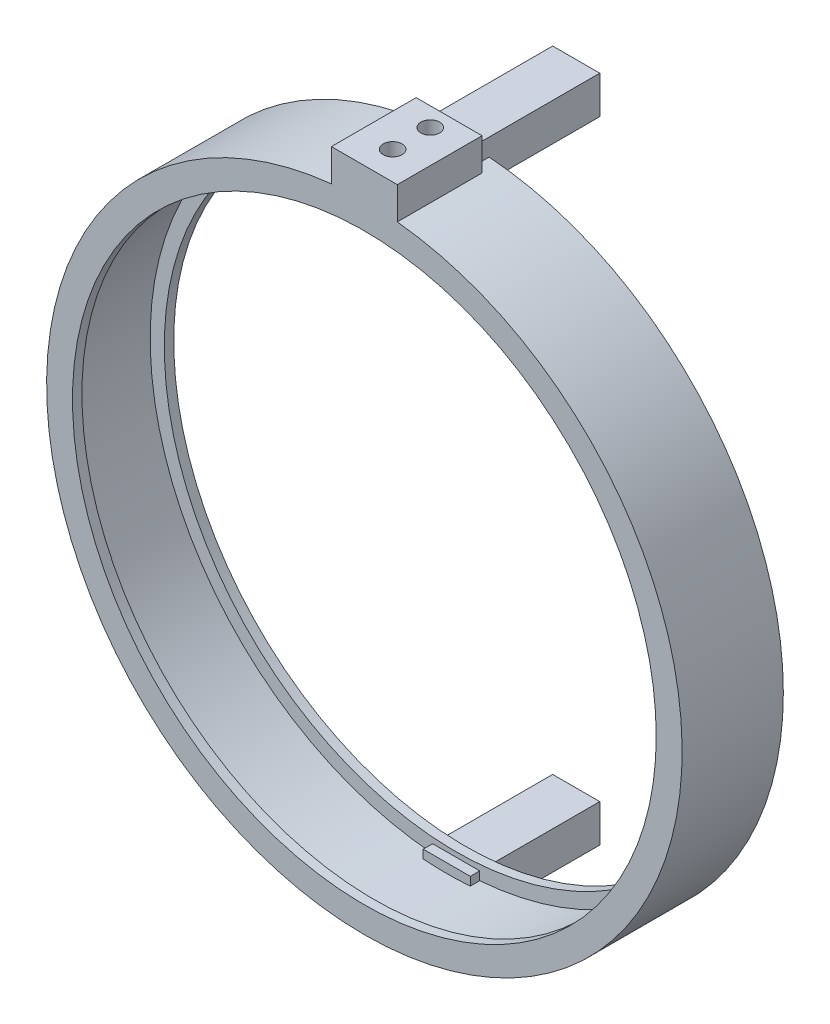
ISO-10303-21;
HEADER;
FILE_DESCRIPTION(('STEP AP214'),'2;1');
FILE_NAME('part.step','',(''),(''),'','','');
FILE_SCHEMA(('AUTOMOTIVE_DESIGN { 1 0 10303 214 1 1 1 1 }'));
ENDSEC;
DATA;
#1=APPLICATION_CONTEXT('core data for automotive mechanical design processes');
#2=APPLICATION_PROTOCOL_DEFINITION('international standard','automotive_design',2000,#1);
#3=PRODUCT_CONTEXT('',#1,'mechanical');
#4=PRODUCT('Part','Part','',(#3));
#5=PRODUCT_RELATED_PRODUCT_CATEGORY('part','',(#4));
#6=PRODUCT_DEFINITION_FORMATION('','',#4);
#7=PRODUCT_DEFINITION_CONTEXT('part definition',#1,'design');
#8=PRODUCT_DEFINITION('design','',#6,#7);
#9=PRODUCT_DEFINITION_SHAPE('','',#8);
#10=(LENGTH_UNIT() NAMED_UNIT(*) SI_UNIT(.MILLI.,.METRE.));
#11=(NAMED_UNIT(*) PLANE_ANGLE_UNIT() SI_UNIT($,.RADIAN.));
#12=(NAMED_UNIT(*) SI_UNIT($,.STERADIAN.) SOLID_ANGLE_UNIT());
#13=UNCERTAINTY_MEASURE_WITH_UNIT(LENGTH_MEASURE(1.E-05),#10,'distance_accuracy_value','');
#14=(GEOMETRIC_REPRESENTATION_CONTEXT(3) GLOBAL_UNCERTAINTY_ASSIGNED_CONTEXT((#13)) GLOBAL_UNIT_ASSIGNED_CONTEXT((#10,
#11,#12)) REPRESENTATION_CONTEXT('',''));
#15=CARTESIAN_POINT('',(0.,0.,0.));
#16=DIRECTION('',(0.,0.,1.));
#17=DIRECTION('',(1.,0.,0.));
#18=AXIS2_PLACEMENT_3D('',#15,#16,#17);
#19=CARTESIAN_POINT('',(-5.,63.,31.5));
#20=DIRECTION('',(0.,0.,1.));
#21=DIRECTION('',(1.,0.,0.));
#22=AXIS2_PLACEMENT_3D('',#19,#20,#21);
#23=PLANE('',#22);
#24=DIRECTION('',(0.,1.,0.));
#25=VECTOR('',#24,1.);
#26=CARTESIAN_POINT('',(-5.,63.,31.5));
#27=LINE('',#26,#25);
#28=CARTESIAN_POINT('',(-5.,63.,31.5));
#29=VERTEX_POINT('',#28);
#30=CARTESIAN_POINT('',(-5.,64.807406984079,31.5));
#31=VERTEX_POINT('',#30);
#32=EDGE_CURVE('E92',#29,#31,#27,.T.);
#33=ORIENTED_EDGE('',*,*,#32,.F.);
#34=DIRECTION('',(1.,0.,0.));
#35=VECTOR('',#34,1.);
#36=CARTESIAN_POINT('',(-5.,63.,31.5));
#37=LINE('',#36,#35);
#38=CARTESIAN_POINT('',(5.,63.,31.5));
#39=VERTEX_POINT('',#38);
#40=EDGE_CURVE('E49',#29,#39,#37,.T.);
#41=ORIENTED_EDGE('',*,*,#40,.T.);
#42=DIRECTION('',(0.,1.,0.));
#43=VECTOR('',#42,1.);
#44=CARTESIAN_POINT('',(5.,63.,31.5));
#45=LINE('',#44,#43);
#46=CARTESIAN_POINT('',(5.,64.807406984079,31.5));
#47=VERTEX_POINT('',#46);
#48=EDGE_CURVE('E11',#39,#47,#45,.T.);
#49=ORIENTED_EDGE('',*,*,#48,.T.);
#50=CARTESIAN_POINT('',(0.,0.,31.5));
#51=DIRECTION('',(0.,0.,1.));
#52=DIRECTION('',(1.,0.,0.));
#53=AXIS2_PLACEMENT_3D('',#50,#51,#52);
#54=CIRCLE('',#53,65.);
#55=EDGE_CURVE('E338',#47,#31,#54,.T.);
#56=ORIENTED_EDGE('',*,*,#55,.T.);
#57=EDGE_LOOP('',(#33,#41,#49,#56));
#58=FACE_BOUND('',#57,.T.);
#59=ADVANCED_FACE('F17',(#58),#23,.T.);
#60=CARTESIAN_POINT('',(-5.,-71.,31.5));
#61=DIRECTION('',(0.,0.,1.));
#62=DIRECTION('',(1.,0.,0.));
#63=AXIS2_PLACEMENT_3D('',#60,#61,#62);
#64=PLANE('',#63);
#65=DIRECTION('',(0.,1.,0.));
#66=VECTOR('',#65,1.);
#67=CARTESIAN_POINT('',(-5.,-71.,31.5));
#68=LINE('',#67,#66);
#69=CARTESIAN_POINT('',(-5.,-64.80740698407,31.5));
#70=VERTEX_POINT('',#69);
#71=CARTESIAN_POINT('',(-5.,-63.,31.5));
#72=VERTEX_POINT('',#71);
#73=EDGE_CURVE('E423',#70,#72,#68,.T.);
#74=ORIENTED_EDGE('',*,*,#73,.F.);
#75=CARTESIAN_POINT('',(0.,0.,31.5));
#76=DIRECTION('',(0.,0.,1.));
#77=DIRECTION('',(1.,0.,0.));
#78=AXIS2_PLACEMENT_3D('',#75,#76,#77);
#79=CIRCLE('',#78,65.);
#80=CARTESIAN_POINT('',(5.,-64.80740698407,31.5));
#81=VERTEX_POINT('',#80);
#82=EDGE_CURVE('E102',#70,#81,#79,.T.);
#83=ORIENTED_EDGE('',*,*,#82,.T.);
#84=DIRECTION('',(0.,1.,0.));
#85=VECTOR('',#84,1.);
#86=CARTESIAN_POINT('',(5.,-71.,31.5));
#87=LINE('',#86,#85);
#88=CARTESIAN_POINT('',(5.,-63.,31.5));
#89=VERTEX_POINT('',#88);
#90=EDGE_CURVE('E414',#81,#89,#87,.T.);
#91=ORIENTED_EDGE('',*,*,#90,.T.);
#92=DIRECTION('',(1.,0.,0.));
#93=VECTOR('',#92,1.);
#94=CARTESIAN_POINT('',(-5.,-63.,31.5));
#95=LINE('',#94,#93);
#96=EDGE_CURVE('E345',#72,#89,#95,.T.);
#97=ORIENTED_EDGE('',*,*,#96,.F.);
#98=EDGE_LOOP('',(#74,#83,#91,#97));
#99=FACE_BOUND('',#98,.T.);
#100=ADVANCED_FACE('F19',(#99),#64,.T.);
#101=CARTESIAN_POINT('',(0.,-67.,10.));
#102=DIRECTION('',(0.,0.,1.));
#103=DIRECTION('',(1.,0.,0.));
#104=AXIS2_PLACEMENT_3D('',#101,#102,#103);
#105=PLANE('',#104);
#106=CARTESIAN_POINT('',(0.,-67.,10.));
#107=DIRECTION('',(0.,0.,1.));
#108=DIRECTION('',(1.,0.,0.));
#109=AXIS2_PLACEMENT_3D('',#106,#107,#108);
#110=CIRCLE('',#109,2.);
#111=CARTESIAN_POINT('',(2.,-67.,10.));
#112=VERTEX_POINT('',#111);
#113=EDGE_CURVE('E386',#112,#112,#110,.T.);
#114=ORIENTED_EDGE('',*,*,#113,.F.);
#115=EDGE_LOOP('',(#114));
#116=FACE_BOUND('',#115,.T.);
#117=ADVANCED_FACE('F606',(#116),#105,.F.);
#118=CARTESIAN_POINT('',(0.,67.,43.));
#119=DIRECTION('',(0.,-1.,0.));
#120=DIRECTION('',(0.,0.,-1.));
#121=AXIS2_PLACEMENT_3D('',#118,#119,#120);
#122=PLANE('',#121);
#123=CARTESIAN_POINT('',(0.,67.,43.));
#124=DIRECTION('',(0.,-1.,0.));
#125=DIRECTION('',(1.,0.,0.));
#126=AXIS2_PLACEMENT_3D('',#123,#124,#125);
#127=CIRCLE('',#126,2.);
#128=CARTESIAN_POINT('',(2.,67.,43.));
#129=VERTEX_POINT('',#128);
#130=EDGE_CURVE('E349',#129,#129,#127,.T.);
#131=ORIENTED_EDGE('',*,*,#130,.F.);
#132=EDGE_LOOP('',(#131));
#133=FACE_BOUND('',#132,.T.);
#134=ADVANCED_FACE('F609',(#133),#122,.F.);
#135=CARTESIAN_POINT('',(0.,67.,35.));
#136=DIRECTION('',(0.,-1.,0.));
#137=DIRECTION('',(0.,0.,-1.));
#138=AXIS2_PLACEMENT_3D('',#135,#136,#137);
#139=PLANE('',#138);
#140=CARTESIAN_POINT('',(0.,67.,35.));
#141=DIRECTION('',(0.,-1.,0.));
#142=DIRECTION('',(1.,0.,0.));
#143=AXIS2_PLACEMENT_3D('',#140,#141,#142);
#144=CIRCLE('',#143,2.);
#145=CARTESIAN_POINT('',(2.,67.,35.));
#146=VERTEX_POINT('',#145);
#147=EDGE_CURVE('E354',#146,#146,#144,.T.);
#148=ORIENTED_EDGE('',*,*,#147,.F.);
#149=EDGE_LOOP('',(#148));
#150=FACE_BOUND('',#149,.T.);
#151=ADVANCED_FACE('F612',(#150),#139,.F.);
#152=CARTESIAN_POINT('',(0.,67.,10.));
#153=DIRECTION('',(0.,0.,1.));
#154=DIRECTION('',(1.,0.,0.));
#155=AXIS2_PLACEMENT_3D('',#152,#153,#154);
#156=PLANE('',#155);
#157=CARTESIAN_POINT('',(0.,67.,10.));
#158=DIRECTION('',(0.,0.,1.));
#159=DIRECTION('',(1.,0.,0.));
#160=AXIS2_PLACEMENT_3D('',#157,#158,#159);
#161=CIRCLE('',#160,2.);
#162=CARTESIAN_POINT('',(2.,67.,10.));
#163=VERTEX_POINT('',#162);
#164=EDGE_CURVE('E407',#163,#163,#161,.T.);
#165=ORIENTED_EDGE('',*,*,#164,.F.);
#166=EDGE_LOOP('',(#165));
#167=FACE_BOUND('',#166,.T.);
#168=ADVANCED_FACE('F614',(#167),#156,.F.);
#169=CARTESIAN_POINT('',(5.,63.,4.));
#170=DIRECTION('',(1.,0.,0.));
#171=DIRECTION('',(0.,1.,0.));
#172=AXIS2_PLACEMENT_3D('',#169,#170,#171);
#173=PLANE('',#172);
#174=DIRECTION('',(0.,0.,1.));
#175=VECTOR('',#174,1.);
#176=CARTESIAN_POINT('',(5.,63.,4.));
#177=LINE('',#176,#175);
#178=CARTESIAN_POINT('',(5.,63.,29.5));
#179=VERTEX_POINT('',#178);
#180=EDGE_CURVE('E21',#179,#39,#177,.T.);
#181=ORIENTED_EDGE('',*,*,#180,.F.);
#182=DIRECTION('',(0.,1.,0.));
#183=VECTOR('',#182,1.);
#184=CARTESIAN_POINT('',(5.,31.5,29.5));
#185=LINE('',#184,#183);
#186=CARTESIAN_POINT('',(5.,64.807406984079,29.5));
#187=VERTEX_POINT('',#186);
#188=EDGE_CURVE('E297',#179,#187,#185,.T.);
#189=ORIENTED_EDGE('',*,*,#188,.T.);
#190=DIRECTION('',(0.,0.,1.));
#191=VECTOR('',#190,1.);
#192=CARTESIAN_POINT('',(5.,64.807406984079,27.5));
#193=LINE('',#192,#191);
#194=EDGE_CURVE('E430',#187,#47,#193,.T.);
#195=ORIENTED_EDGE('',*,*,#194,.T.);
#196=ORIENTED_EDGE('',*,*,#48,.F.);
#197=EDGE_LOOP('',(#181,#189,#195,#196));
#198=FACE_BOUND('',#197,.T.);
#199=ADVANCED_FACE('F441',(#198),#173,.T.);
#200=CARTESIAN_POINT('',(-5.,63.,4.));
#201=DIRECTION('',(0.,1.,0.));
#202=DIRECTION('',(1.,0.,0.));
#203=AXIS2_PLACEMENT_3D('',#200,#201,#202);
#204=PLANE('',#203);
#205=ORIENTED_EDGE('',*,*,#40,.F.);
#206=DIRECTION('',(0.,0.,1.));
#207=VECTOR('',#206,1.);
#208=CARTESIAN_POINT('',(-5.,63.,4.));
#209=LINE('',#208,#207);
#210=CARTESIAN_POINT('',(-5.,63.,29.5));
#211=VERTEX_POINT('',#210);
#212=EDGE_CURVE('E378',#211,#29,#209,.T.);
#213=ORIENTED_EDGE('',*,*,#212,.F.);
#214=DIRECTION('',(-1.,0.,0.));
#215=VECTOR('',#214,1.);
#216=CARTESIAN_POINT('',(-2.5,63.,29.5));
#217=LINE('',#216,#215);
#218=EDGE_CURVE('E390',#179,#211,#217,.T.);
#219=ORIENTED_EDGE('',*,*,#218,.F.);
#220=ORIENTED_EDGE('',*,*,#180,.T.);
#221=EDGE_LOOP('',(#205,#213,#219,#220));
#222=FACE_BOUND('',#221,.T.);
#223=ADVANCED_FACE('F439',(#222),#204,.F.);
#224=CARTESIAN_POINT('',(-5.,63.,4.));
#225=DIRECTION('',(1.,0.,0.));
#226=DIRECTION('',(0.,1.,0.));
#227=AXIS2_PLACEMENT_3D('',#224,#225,#226);
#228=PLANE('',#227);
#229=ORIENTED_EDGE('',*,*,#32,.T.);
#230=DIRECTION('',(0.,0.,1.));
#231=VECTOR('',#230,1.);
#232=CARTESIAN_POINT('',(-5.,64.807406984079,27.5));
#233=LINE('',#232,#231);
#234=CARTESIAN_POINT('',(-5.,64.807406984079,29.5));
#235=VERTEX_POINT('',#234);
#236=EDGE_CURVE('E334',#235,#31,#233,.T.);
#237=ORIENTED_EDGE('',*,*,#236,.F.);
#238=DIRECTION('',(0.,1.,0.));
#239=VECTOR('',#238,1.);
#240=CARTESIAN_POINT('',(-5.,31.5,29.5));
#241=LINE('',#240,#239);
#242=EDGE_CURVE('E394',#211,#235,#241,.T.);
#243=ORIENTED_EDGE('',*,*,#242,.F.);
#244=ORIENTED_EDGE('',*,*,#212,.T.);
#245=EDGE_LOOP('',(#229,#237,#243,#244));
#246=FACE_BOUND('',#245,.T.);
#247=ADVANCED_FACE('F620',(#246),#228,.F.);
#248=CARTESIAN_POINT('',(0.,0.,27.5));
#249=DIRECTION('',(0.,0.,1.));
#250=DIRECTION('',(1.,0.,0.));
#251=AXIS2_PLACEMENT_3D('',#248,#249,#250);
#252=CYLINDRICAL_SURFACE('',#251,65.);
#253=CARTESIAN_POINT('',(0.,0.,47.));
#254=DIRECTION('',(0.,0.,1.));
#255=DIRECTION('',(1.,0.,0.));
#256=AXIS2_PLACEMENT_3D('',#253,#254,#255);
#257=CIRCLE('',#256,65.);
#258=CARTESIAN_POINT('',(65.,0.,47.));
#259=VERTEX_POINT('',#258);
#260=EDGE_CURVE('E353',#259,#259,#257,.T.);
#261=ORIENTED_EDGE('',*,*,#260,.T.);
#262=EDGE_LOOP('',(#261));
#263=FACE_BOUND('',#262,.T.);
#264=DIRECTION('',(0.,0.,1.));
#265=VECTOR('',#264,1.);
#266=CARTESIAN_POINT('',(5.,-64.80740698407,27.5));
#267=LINE('',#266,#265);
#268=CARTESIAN_POINT('',(5.,-64.80740698407,29.5));
#269=VERTEX_POINT('',#268);
#270=EDGE_CURVE('E153',#269,#81,#267,.T.);
#271=ORIENTED_EDGE('',*,*,#270,.T.);
#272=ORIENTED_EDGE('',*,*,#82,.F.);
#273=DIRECTION('',(0.,0.,1.));
#274=VECTOR('',#273,1.);
#275=CARTESIAN_POINT('',(-5.,-64.80740698407,27.5));
#276=LINE('',#275,#274);
#277=CARTESIAN_POINT('',(-5.,-64.80740698407,29.5));
#278=VERTEX_POINT('',#277);
#279=EDGE_CURVE('E348',#278,#70,#276,.T.);
#280=ORIENTED_EDGE('',*,*,#279,.F.);
#281=CARTESIAN_POINT('',(0.,0.,29.5));
#282=DIRECTION('',(0.,0.,1.));
#283=DIRECTION('',(1.,0.,0.));
#284=AXIS2_PLACEMENT_3D('',#281,#282,#283);
#285=CIRCLE('',#284,65.);
#286=EDGE_CURVE('E398',#235,#278,#285,.T.);
#287=ORIENTED_EDGE('',*,*,#286,.F.);
#288=ORIENTED_EDGE('',*,*,#236,.T.);
#289=ORIENTED_EDGE('',*,*,#55,.F.);
#290=ORIENTED_EDGE('',*,*,#194,.F.);
#291=CARTESIAN_POINT('',(0.,0.,29.5));
#292=DIRECTION('',(0.,0.,1.));
#293=DIRECTION('',(1.,0.,0.));
#294=AXIS2_PLACEMENT_3D('',#291,#292,#293);
#295=CIRCLE('',#294,65.);
#296=EDGE_CURVE('E294',#269,#187,#295,.T.);
#297=ORIENTED_EDGE('',*,*,#296,.F.);
#298=EDGE_LOOP('',(#271,#272,#280,#287,#288,#289,#290,#297));
#299=FACE_BOUND('',#298,.T.);
#300=ADVANCED_FACE('F448',(#263,#299),#252,.F.);
#301=CARTESIAN_POINT('',(-5.,-71.,4.));
#302=DIRECTION('',(1.,0.,0.));
#303=DIRECTION('',(0.,1.,0.));
#304=AXIS2_PLACEMENT_3D('',#301,#302,#303);
#305=PLANE('',#304);
#306=DIRECTION('',(0.,0.,1.));
#307=VECTOR('',#306,1.);
#308=CARTESIAN_POINT('',(-5.,-63.,4.));
#309=LINE('',#308,#307);
#310=CARTESIAN_POINT('',(-5.,-63.,29.5));
#311=VERTEX_POINT('',#310);
#312=EDGE_CURVE('E310',#311,#72,#309,.T.);
#313=ORIENTED_EDGE('',*,*,#312,.F.);
#314=DIRECTION('',(0.,1.,0.));
#315=VECTOR('',#314,1.);
#316=CARTESIAN_POINT('',(-5.,-35.5,29.5));
#317=LINE('',#316,#315);
#318=EDGE_CURVE('E399',#278,#311,#317,.T.);
#319=ORIENTED_EDGE('',*,*,#318,.F.);
#320=ORIENTED_EDGE('',*,*,#279,.T.);
#321=ORIENTED_EDGE('',*,*,#73,.T.);
#322=EDGE_LOOP('',(#313,#319,#320,#321));
#323=FACE_BOUND('',#322,.T.);
#324=ADVANCED_FACE('F627',(#323),#305,.F.);
#325=CARTESIAN_POINT('',(-5.,-63.,4.));
#326=DIRECTION('',(0.,1.,0.));
#327=DIRECTION('',(1.,0.,0.));
#328=AXIS2_PLACEMENT_3D('',#325,#326,#327);
#329=PLANE('',#328);
#330=DIRECTION('',(0.,0.,1.));
#331=VECTOR('',#330,1.);
#332=CARTESIAN_POINT('',(5.,-63.,4.));
#333=LINE('',#332,#331);
#334=CARTESIAN_POINT('',(5.,-63.,29.5));
#335=VERTEX_POINT('',#334);
#336=EDGE_CURVE('E306',#335,#89,#333,.T.);
#337=ORIENTED_EDGE('',*,*,#336,.F.);
#338=DIRECTION('',(-1.,0.,0.));
#339=VECTOR('',#338,1.);
#340=CARTESIAN_POINT('',(-2.5,-63.,29.5));
#341=LINE('',#340,#339);
#342=EDGE_CURVE('E402',#335,#311,#341,.T.);
#343=ORIENTED_EDGE('',*,*,#342,.T.);
#344=ORIENTED_EDGE('',*,*,#312,.T.);
#345=ORIENTED_EDGE('',*,*,#96,.T.);
#346=EDGE_LOOP('',(#337,#343,#344,#345));
#347=FACE_BOUND('',#346,.T.);
#348=ADVANCED_FACE('F633',(#347),#329,.T.);
#349=CARTESIAN_POINT('',(5.,-71.,4.));
#350=DIRECTION('',(1.,0.,0.));
#351=DIRECTION('',(0.,1.,0.));
#352=AXIS2_PLACEMENT_3D('',#349,#350,#351);
#353=PLANE('',#352);
#354=ORIENTED_EDGE('',*,*,#90,.F.);
#355=ORIENTED_EDGE('',*,*,#270,.F.);
#356=DIRECTION('',(0.,1.,0.));
#357=VECTOR('',#356,1.);
#358=CARTESIAN_POINT('',(5.,-35.5,29.5));
#359=LINE('',#358,#357);
#360=EDGE_CURVE('E298',#269,#335,#359,.T.);
#361=ORIENTED_EDGE('',*,*,#360,.T.);
#362=ORIENTED_EDGE('',*,*,#336,.T.);
#363=EDGE_LOOP('',(#354,#355,#361,#362));
#364=FACE_BOUND('',#363,.T.);
#365=ADVANCED_FACE('F629',(#364),#353,.T.);
#366=CARTESIAN_POINT('',(0.,-67.,-2.));
#367=DIRECTION('',(0.,0.,1.));
#368=DIRECTION('',(1.,0.,0.));
#369=AXIS2_PLACEMENT_3D('',#366,#367,#368);
#370=CYLINDRICAL_SURFACE('',#369,2.);
#371=ORIENTED_EDGE('',*,*,#113,.T.);
#372=EDGE_LOOP('',(#371));
#373=FACE_BOUND('',#372,.T.);
#374=CARTESIAN_POINT('',(0.,-67.,4.));
#375=DIRECTION('',(0.,0.,1.));
#376=DIRECTION('',(1.,0.,0.));
#377=AXIS2_PLACEMENT_3D('',#374,#375,#376);
#378=CIRCLE('',#377,2.);
#379=CARTESIAN_POINT('',(2.,-67.,4.));
#380=VERTEX_POINT('',#379);
#381=EDGE_CURVE('E374',#380,#380,#378,.T.);
#382=ORIENTED_EDGE('',*,*,#381,.F.);
#383=EDGE_LOOP('',(#382));
#384=FACE_BOUND('',#383,.T.);
#385=ADVANCED_FACE('F632',(#373,#384),#370,.F.);
#386=CARTESIAN_POINT('',(0.,0.,47.));
#387=DIRECTION('',(0.,0.,1.));
#388=DIRECTION('',(1.,0.,0.));
#389=AXIS2_PLACEMENT_3D('',#386,#387,#388);
#390=PLANE('',#389);
#391=CARTESIAN_POINT('',(0.,0.,47.));
#392=DIRECTION('',(0.,0.,1.));
#393=DIRECTION('',(1.,0.,0.));
#394=AXIS2_PLACEMENT_3D('',#391,#392,#393);
#395=CIRCLE('',#394,62.);
#396=CARTESIAN_POINT('',(62.,0.,47.));
#397=VERTEX_POINT('',#396);
#398=EDGE_CURVE('E285',#397,#397,#395,.T.);
#399=ORIENTED_EDGE('',*,*,#398,.T.);
#400=EDGE_LOOP('',(#399));
#401=FACE_BOUND('',#400,.T.);
#402=ORIENTED_EDGE('',*,*,#260,.F.);
#403=EDGE_LOOP('',(#402));
#404=FACE_BOUND('',#403,.T.);
#405=ADVANCED_FACE('F636',(#401,#404),#390,.F.);
#406=CARTESIAN_POINT('',(0.,81.,43.));
#407=DIRECTION('',(0.,-1.,0.));
#408=DIRECTION('',(1.,0.,0.));
#409=AXIS2_PLACEMENT_3D('',#406,#407,#408);
#410=CYLINDRICAL_SURFACE('',#409,2.);
#411=ORIENTED_EDGE('',*,*,#130,.T.);
#412=EDGE_LOOP('',(#411));
#413=FACE_BOUND('',#412,.T.);
#414=CARTESIAN_POINT('',(0.,74.,43.));
#415=DIRECTION('',(0.,-1.,0.));
#416=DIRECTION('',(1.,0.,0.));
#417=AXIS2_PLACEMENT_3D('',#414,#415,#416);
#418=CIRCLE('',#417,2.);
#419=CARTESIAN_POINT('',(2.,74.,43.));
#420=VERTEX_POINT('',#419);
#421=EDGE_CURVE('E281',#420,#420,#418,.T.);
#422=ORIENTED_EDGE('',*,*,#421,.F.);
#423=EDGE_LOOP('',(#422));
#424=FACE_BOUND('',#423,.T.);
#425=ADVANCED_FACE('F640',(#413,#424),#410,.F.);
#426=CARTESIAN_POINT('',(0.,81.,35.));
#427=DIRECTION('',(0.,-1.,0.));
#428=DIRECTION('',(1.,0.,0.));
#429=AXIS2_PLACEMENT_3D('',#426,#427,#428);
#430=CYLINDRICAL_SURFACE('',#429,2.);
#431=ORIENTED_EDGE('',*,*,#147,.T.);
#432=EDGE_LOOP('',(#431));
#433=FACE_BOUND('',#432,.T.);
#434=CARTESIAN_POINT('',(0.,74.,35.));
#435=DIRECTION('',(0.,-1.,0.));
#436=DIRECTION('',(1.,0.,0.));
#437=AXIS2_PLACEMENT_3D('',#434,#435,#436);
#438=CIRCLE('',#437,2.);
#439=CARTESIAN_POINT('',(2.,74.,35.));
#440=VERTEX_POINT('',#439);
#441=EDGE_CURVE('E286',#440,#440,#438,.T.);
#442=ORIENTED_EDGE('',*,*,#441,.F.);
#443=EDGE_LOOP('',(#442));
#444=FACE_BOUND('',#443,.T.);
#445=ADVANCED_FACE('F599',(#433,#444),#430,.F.);
#446=CARTESIAN_POINT('',(0.,67.,-2.));
#447=DIRECTION('',(0.,0.,1.));
#448=DIRECTION('',(1.,0.,0.));
#449=AXIS2_PLACEMENT_3D('',#446,#447,#448);
#450=CYLINDRICAL_SURFACE('',#449,2.);
#451=ORIENTED_EDGE('',*,*,#164,.T.);
#452=EDGE_LOOP('',(#451));
#453=FACE_BOUND('',#452,.T.);
#454=CARTESIAN_POINT('',(0.,67.,4.));
#455=DIRECTION('',(0.,0.,1.));
#456=DIRECTION('',(1.,0.,0.));
#457=AXIS2_PLACEMENT_3D('',#454,#455,#456);
#458=CIRCLE('',#457,2.);
#459=CARTESIAN_POINT('',(2.,67.,4.));
#460=VERTEX_POINT('',#459);
#461=EDGE_CURVE('E367',#460,#460,#458,.T.);
#462=ORIENTED_EDGE('',*,*,#461,.F.);
#463=EDGE_LOOP('',(#462));
#464=FACE_BOUND('',#463,.T.);
#465=ADVANCED_FACE('F589',(#453,#464),#450,.F.);
#466=CARTESIAN_POINT('',(0.,0.,29.5));
#467=DIRECTION('',(0.,0.,1.));
#468=DIRECTION('',(1.,0.,0.));
#469=AXIS2_PLACEMENT_3D('',#466,#467,#468);
#470=PLANE('',#469);
#471=CARTESIAN_POINT('',(0.,0.,29.5));
#472=DIRECTION('',(0.,0.,1.));
#473=DIRECTION('',(1.,0.,0.));
#474=AXIS2_PLACEMENT_3D('',#471,#472,#473);
#475=CIRCLE('',#474,62.);
#476=CARTESIAN_POINT('',(62.,0.,29.5));
#477=VERTEX_POINT('',#476);
#478=EDGE_CURVE('E368',#477,#477,#475,.T.);
#479=ORIENTED_EDGE('',*,*,#478,.F.);
#480=EDGE_LOOP('',(#479));
#481=FACE_BOUND('',#480,.T.);
#482=ORIENTED_EDGE('',*,*,#360,.F.);
#483=ORIENTED_EDGE('',*,*,#296,.T.);
#484=ORIENTED_EDGE('',*,*,#188,.F.);
#485=ORIENTED_EDGE('',*,*,#218,.T.);
#486=ORIENTED_EDGE('',*,*,#242,.T.);
#487=ORIENTED_EDGE('',*,*,#286,.T.);
#488=ORIENTED_EDGE('',*,*,#318,.T.);
#489=ORIENTED_EDGE('',*,*,#342,.F.);
#490=EDGE_LOOP('',(#482,#483,#484,#485,#486,#487,#488,#489));
#491=FACE_BOUND('',#490,.T.);
#492=ADVANCED_FACE('F446',(#481,#491),#470,.T.);
#493=CARTESIAN_POINT('',(-5.,-71.,4.));
#494=DIRECTION('',(0.,1.,0.));
#495=DIRECTION('',(1.,0.,0.));
#496=AXIS2_PLACEMENT_3D('',#493,#494,#495);
#497=PLANE('',#496);
#498=DIRECTION('',(0.,0.,1.));
#499=VECTOR('',#498,1.);
#500=CARTESIAN_POINT('',(5.,-71.,4.));
#501=LINE('',#500,#499);
#502=CARTESIAN_POINT('',(5.,-71.,4.));
#503=VERTEX_POINT('',#502);
#504=CARTESIAN_POINT('',(5.,-71.,31.5));
#505=VERTEX_POINT('',#504);
#506=EDGE_CURVE('E339',#503,#505,#501,.T.);
#507=ORIENTED_EDGE('',*,*,#506,.T.);
#508=DIRECTION('',(1.,0.,0.));
#509=VECTOR('',#508,1.);
#510=CARTESIAN_POINT('',(-5.,-71.,31.5));
#511=LINE('',#510,#509);
#512=CARTESIAN_POINT('',(-5.,-71.,31.5));
#513=VERTEX_POINT('',#512);
#514=EDGE_CURVE('E329',#513,#505,#511,.T.);
#515=ORIENTED_EDGE('',*,*,#514,.F.);
#516=DIRECTION('',(0.,0.,1.));
#517=VECTOR('',#516,1.);
#518=CARTESIAN_POINT('',(-5.,-71.,4.));
#519=LINE('',#518,#517);
#520=CARTESIAN_POINT('',(-5.,-71.,4.));
#521=VERTEX_POINT('',#520);
#522=EDGE_CURVE('E322',#521,#513,#519,.T.);
#523=ORIENTED_EDGE('',*,*,#522,.F.);
#524=DIRECTION('',(1.,0.,0.));
#525=VECTOR('',#524,1.);
#526=CARTESIAN_POINT('',(-5.,-71.,4.));
#527=LINE('',#526,#525);
#528=EDGE_CURVE('E302',#521,#503,#527,.T.);
#529=ORIENTED_EDGE('',*,*,#528,.T.);
#530=EDGE_LOOP('',(#507,#515,#523,#529));
#531=FACE_BOUND('',#530,.T.);
#532=ADVANCED_FACE('F588',(#531),#497,.F.);
#533=CARTESIAN_POINT('',(-5.,-71.,4.));
#534=DIRECTION('',(0.,0.,1.));
#535=DIRECTION('',(1.,0.,0.));
#536=AXIS2_PLACEMENT_3D('',#533,#534,#535);
#537=PLANE('',#536);
#538=ORIENTED_EDGE('',*,*,#381,.T.);
#539=EDGE_LOOP('',(#538));
#540=FACE_BOUND('',#539,.T.);
#541=DIRECTION('',(1.,0.,0.));
#542=VECTOR('',#541,1.);
#543=CARTESIAN_POINT('',(-5.,-63.,4.));
#544=LINE('',#543,#542);
#545=CARTESIAN_POINT('',(-5.,-63.,4.));
#546=VERTEX_POINT('',#545);
#547=CARTESIAN_POINT('',(5.,-63.,4.));
#548=VERTEX_POINT('',#547);
#549=EDGE_CURVE('E142',#546,#548,#544,.T.);
#550=ORIENTED_EDGE('',*,*,#549,.T.);
#551=DIRECTION('',(0.,1.,0.));
#552=VECTOR('',#551,1.);
#553=CARTESIAN_POINT('',(5.,-71.,4.));
#554=LINE('',#553,#552);
#555=EDGE_CURVE('E342',#503,#548,#554,.T.);
#556=ORIENTED_EDGE('',*,*,#555,.F.);
#557=ORIENTED_EDGE('',*,*,#528,.F.);
#558=DIRECTION('',(0.,1.,0.));
#559=VECTOR('',#558,1.);
#560=CARTESIAN_POINT('',(-5.,-71.,4.));
#561=LINE('',#560,#559);
#562=EDGE_CURVE('E321',#521,#546,#561,.T.);
#563=ORIENTED_EDGE('',*,*,#562,.T.);
#564=EDGE_LOOP('',(#550,#556,#557,#563));
#565=FACE_BOUND('',#564,.T.);
#566=ADVANCED_FACE('F596',(#540,#565),#537,.F.);
#567=CARTESIAN_POINT('',(0.,0.,47.));
#568=DIRECTION('',(0.,0.,1.));
#569=DIRECTION('',(1.,0.,0.));
#570=AXIS2_PLACEMENT_3D('',#567,#568,#569);
#571=CYLINDRICAL_SURFACE('',#570,62.);
#572=CARTESIAN_POINT('',(0.,0.,49.));
#573=DIRECTION('',(0.,0.,1.));
#574=DIRECTION('',(1.,0.,0.));
#575=AXIS2_PLACEMENT_3D('',#572,#573,#574);
#576=CIRCLE('',#575,62.);
#577=CARTESIAN_POINT('',(62.,0.,49.));
#578=VERTEX_POINT('',#577);
#579=EDGE_CURVE('E246',#578,#578,#576,.T.);
#580=ORIENTED_EDGE('',*,*,#579,.T.);
#581=EDGE_LOOP('',(#580));
#582=FACE_BOUND('',#581,.T.);
#583=ORIENTED_EDGE('',*,*,#398,.F.);
#584=EDGE_LOOP('',(#583));
#585=FACE_BOUND('',#584,.T.);
#586=ADVANCED_FACE('F654',(#582,#585),#571,.F.);
#587=CARTESIAN_POINT('',(-7.,74.,31.));
#588=DIRECTION('',(0.,1.,0.));
#589=DIRECTION('',(1.,0.,0.));
#590=AXIS2_PLACEMENT_3D('',#587,#588,#589);
#591=PLANE('',#590);
#592=ORIENTED_EDGE('',*,*,#421,.T.);
#593=EDGE_LOOP('',(#592));
#594=FACE_BOUND('',#593,.T.);
#595=ORIENTED_EDGE('',*,*,#441,.T.);
#596=EDGE_LOOP('',(#595));
#597=FACE_BOUND('',#596,.T.);
#598=DIRECTION('',(1.,0.,0.));
#599=VECTOR('',#598,1.);
#600=CARTESIAN_POINT('',(-7.,74.,31.));
#601=LINE('',#600,#599);
#602=CARTESIAN_POINT('',(-7.,74.,31.));
#603=VERTEX_POINT('',#602);
#604=CARTESIAN_POINT('',(7.,74.,31.));
#605=VERTEX_POINT('',#604);
#606=EDGE_CURVE('E252',#603,#605,#601,.T.);
#607=ORIENTED_EDGE('',*,*,#606,.F.);
#608=DIRECTION('',(0.,0.,1.));
#609=VECTOR('',#608,1.);
#610=CARTESIAN_POINT('',(-7.,74.,31.));
#611=LINE('',#610,#609);
#612=CARTESIAN_POINT('',(-7.,74.,49.));
#613=VERTEX_POINT('',#612);
#614=EDGE_CURVE('E236',#603,#613,#611,.T.);
#615=ORIENTED_EDGE('',*,*,#614,.T.);
#616=DIRECTION('',(1.,0.,0.));
#617=VECTOR('',#616,1.);
#618=CARTESIAN_POINT('',(-7.,74.,49.));
#619=LINE('',#618,#617);
#620=CARTESIAN_POINT('',(7.,74.,49.));
#621=VERTEX_POINT('',#620);
#622=EDGE_CURVE('E167',#613,#621,#619,.T.);
#623=ORIENTED_EDGE('',*,*,#622,.T.);
#624=DIRECTION('',(0.,0.,1.));
#625=VECTOR('',#624,1.);
#626=CARTESIAN_POINT('',(7.,74.,31.));
#627=LINE('',#626,#625);
#628=EDGE_CURVE('E261',#605,#621,#627,.T.);
#629=ORIENTED_EDGE('',*,*,#628,.F.);
#630=EDGE_LOOP('',(#607,#615,#623,#629));
#631=FACE_BOUND('',#630,.T.);
#632=ADVANCED_FACE('F260',(#594,#597,#631),#591,.T.);
#633=CARTESIAN_POINT('',(-5.,63.,4.));
#634=DIRECTION('',(0.,0.,1.));
#635=DIRECTION('',(1.,0.,0.));
#636=AXIS2_PLACEMENT_3D('',#633,#634,#635);
#637=PLANE('',#636);
#638=ORIENTED_EDGE('',*,*,#461,.T.);
#639=EDGE_LOOP('',(#638));
#640=FACE_BOUND('',#639,.T.);
#641=DIRECTION('',(1.,0.,0.));
#642=VECTOR('',#641,1.);
#643=CARTESIAN_POINT('',(-5.,71.,4.));
#644=LINE('',#643,#642);
#645=CARTESIAN_POINT('',(-5.,71.,4.));
#646=VERTEX_POINT('',#645);
#647=CARTESIAN_POINT('',(5.,71.,4.));
#648=VERTEX_POINT('',#647);
#649=EDGE_CURVE('E364',#646,#648,#644,.T.);
#650=ORIENTED_EDGE('',*,*,#649,.T.);
#651=DIRECTION('',(0.,1.,0.));
#652=VECTOR('',#651,1.);
#653=CARTESIAN_POINT('',(5.,63.,4.));
#654=LINE('',#653,#652);
#655=CARTESIAN_POINT('',(5.,63.,4.));
#656=VERTEX_POINT('',#655);
#657=EDGE_CURVE('E496',#656,#648,#654,.T.);
#658=ORIENTED_EDGE('',*,*,#657,.F.);
#659=DIRECTION('',(1.,0.,0.));
#660=VECTOR('',#659,1.);
#661=CARTESIAN_POINT('',(-5.,63.,4.));
#662=LINE('',#661,#660);
#663=CARTESIAN_POINT('',(-5.,63.,4.));
#664=VERTEX_POINT('',#663);
#665=EDGE_CURVE('E361',#664,#656,#662,.T.);
#666=ORIENTED_EDGE('',*,*,#665,.F.);
#667=DIRECTION('',(0.,1.,0.));
#668=VECTOR('',#667,1.);
#669=CARTESIAN_POINT('',(-5.,63.,4.));
#670=LINE('',#669,#668);
#671=EDGE_CURVE('E313',#664,#646,#670,.T.);
#672=ORIENTED_EDGE('',*,*,#671,.T.);
#673=EDGE_LOOP('',(#650,#658,#666,#672));
#674=FACE_BOUND('',#673,.T.);
#675=ADVANCED_FACE('F509',(#640,#674),#637,.F.);
#676=CARTESIAN_POINT('',(-5.,71.,4.));
#677=DIRECTION('',(0.,1.,0.));
#678=DIRECTION('',(1.,0.,0.));
#679=AXIS2_PLACEMENT_3D('',#676,#677,#678);
#680=PLANE('',#679);
#681=DIRECTION('',(0.,0.,1.));
#682=VECTOR('',#681,1.);
#683=CARTESIAN_POINT('',(5.,71.,4.));
#684=LINE('',#683,#682);
#685=CARTESIAN_POINT('',(5.,71.,31.));
#686=VERTEX_POINT('',#685);
#687=EDGE_CURVE('E274',#648,#686,#684,.T.);
#688=ORIENTED_EDGE('',*,*,#687,.F.);
#689=ORIENTED_EDGE('',*,*,#649,.F.);
#690=DIRECTION('',(0.,0.,1.));
#691=VECTOR('',#690,1.);
#692=CARTESIAN_POINT('',(-5.,71.,4.));
#693=LINE('',#692,#691);
#694=CARTESIAN_POINT('',(-5.,71.,31.));
#695=VERTEX_POINT('',#694);
#696=EDGE_CURVE('E178',#646,#695,#693,.T.);
#697=ORIENTED_EDGE('',*,*,#696,.T.);
#698=DIRECTION('',(1.,0.,0.));
#699=VECTOR('',#698,1.);
#700=CARTESIAN_POINT('',(-6.,71.,31.));
#701=LINE('',#700,#699);
#702=EDGE_CURVE('E271',#695,#686,#701,.T.);
#703=ORIENTED_EDGE('',*,*,#702,.T.);
#704=EDGE_LOOP('',(#688,#689,#697,#703));
#705=FACE_BOUND('',#704,.T.);
#706=ADVANCED_FACE('F513',(#705),#680,.T.);
#707=CARTESIAN_POINT('',(0.,0.,27.5));
#708=DIRECTION('',(0.,0.,1.));
#709=DIRECTION('',(1.,0.,0.));
#710=AXIS2_PLACEMENT_3D('',#707,#708,#709);
#711=CYLINDRICAL_SURFACE('',#710,62.);
#712=ORIENTED_EDGE('',*,*,#478,.T.);
#713=EDGE_LOOP('',(#712));
#714=FACE_BOUND('',#713,.T.);
#715=CARTESIAN_POINT('',(0.,0.,27.5));
#716=DIRECTION('',(0.,0.,1.));
#717=DIRECTION('',(1.,0.,0.));
#718=AXIS2_PLACEMENT_3D('',#715,#716,#717);
#719=CIRCLE('',#718,62.);
#720=CARTESIAN_POINT('',(62.,0.,27.5));
#721=VERTEX_POINT('',#720);
#722=EDGE_CURVE('E487',#721,#721,#719,.T.);
#723=ORIENTED_EDGE('',*,*,#722,.F.);
#724=EDGE_LOOP('',(#723));
#725=FACE_BOUND('',#724,.T.);
#726=ADVANCED_FACE('F584',(#714,#725),#711,.F.);
#727=CARTESIAN_POINT('',(-5.,-63.,4.));
#728=DIRECTION('',(0.,1.,0.));
#729=DIRECTION('',(1.,0.,0.));
#730=AXIS2_PLACEMENT_3D('',#727,#728,#729);
#731=PLANE('',#730);
#732=DIRECTION('',(0.,0.,1.));
#733=VECTOR('',#732,1.);
#734=CARTESIAN_POINT('',(5.,-63.,4.));
#735=LINE('',#734,#733);
#736=CARTESIAN_POINT('',(5.,-63.,27.5));
#737=VERTEX_POINT('',#736);
#738=EDGE_CURVE('E358',#548,#737,#735,.T.);
#739=ORIENTED_EDGE('',*,*,#738,.F.);
#740=ORIENTED_EDGE('',*,*,#549,.F.);
#741=DIRECTION('',(0.,0.,1.));
#742=VECTOR('',#741,1.);
#743=CARTESIAN_POINT('',(-5.,-63.,4.));
#744=LINE('',#743,#742);
#745=CARTESIAN_POINT('',(-5.,-63.,27.5));
#746=VERTEX_POINT('',#745);
#747=EDGE_CURVE('E318',#546,#746,#744,.T.);
#748=ORIENTED_EDGE('',*,*,#747,.T.);
#749=DIRECTION('',(-1.,0.,0.));
#750=VECTOR('',#749,1.);
#751=CARTESIAN_POINT('',(-2.5,-63.,27.5));
#752=LINE('',#751,#750);
#753=EDGE_CURVE('E465',#737,#746,#752,.T.);
#754=ORIENTED_EDGE('',*,*,#753,.F.);
#755=EDGE_LOOP('',(#739,#740,#748,#754));
#756=FACE_BOUND('',#755,.T.);
#757=ADVANCED_FACE('F722',(#756),#731,.T.);
#758=CARTESIAN_POINT('',(-5.,63.,4.));
#759=DIRECTION('',(0.,1.,0.));
#760=DIRECTION('',(1.,0.,0.));
#761=AXIS2_PLACEMENT_3D('',#758,#759,#760);
#762=PLANE('',#761);
#763=DIRECTION('',(-1.,0.,0.));
#764=VECTOR('',#763,1.);
#765=CARTESIAN_POINT('',(-2.5,63.,27.5));
#766=LINE('',#765,#764);
#767=CARTESIAN_POINT('',(5.,63.,27.5));
#768=VERTEX_POINT('',#767);
#769=CARTESIAN_POINT('',(-5.,63.,27.5));
#770=VERTEX_POINT('',#769);
#771=EDGE_CURVE('E478',#768,#770,#766,.T.);
#772=ORIENTED_EDGE('',*,*,#771,.T.);
#773=DIRECTION('',(0.,0.,1.));
#774=VECTOR('',#773,1.);
#775=CARTESIAN_POINT('',(-5.,63.,4.));
#776=LINE('',#775,#774);
#777=EDGE_CURVE('E314',#664,#770,#776,.T.);
#778=ORIENTED_EDGE('',*,*,#777,.F.);
#779=ORIENTED_EDGE('',*,*,#665,.T.);
#780=DIRECTION('',(0.,0.,1.));
#781=VECTOR('',#780,1.);
#782=CARTESIAN_POINT('',(5.,63.,4.));
#783=LINE('',#782,#781);
#784=EDGE_CURVE('E493',#656,#768,#783,.T.);
#785=ORIENTED_EDGE('',*,*,#784,.T.);
#786=EDGE_LOOP('',(#772,#778,#779,#785));
#787=FACE_BOUND('',#786,.T.);
#788=ADVANCED_FACE('F556',(#787),#762,.F.);
#789=CARTESIAN_POINT('',(5.,-71.,4.));
#790=DIRECTION('',(1.,0.,0.));
#791=DIRECTION('',(0.,1.,0.));
#792=AXIS2_PLACEMENT_3D('',#789,#790,#791);
#793=PLANE('',#792);
#794=DIRECTION('',(0.,1.,0.));
#795=VECTOR('',#794,1.);
#796=CARTESIAN_POINT('',(5.,-71.,31.5));
#797=LINE('',#796,#795);
#798=CARTESIAN_POINT('',(5.,-67.31456008918,31.5));
#799=VERTEX_POINT('',#798);
#800=EDGE_CURVE('E333',#505,#799,#797,.T.);
#801=ORIENTED_EDGE('',*,*,#800,.F.);
#802=ORIENTED_EDGE('',*,*,#506,.F.);
#803=ORIENTED_EDGE('',*,*,#555,.T.);
#804=ORIENTED_EDGE('',*,*,#738,.T.);
#805=DIRECTION('',(0.,1.,0.));
#806=VECTOR('',#805,1.);
#807=CARTESIAN_POINT('',(5.,-35.5,27.5));
#808=LINE('',#807,#806);
#809=CARTESIAN_POINT('',(5.,-67.31456008918,27.5));
#810=VERTEX_POINT('',#809);
#811=EDGE_CURVE('E477',#810,#737,#808,.T.);
#812=ORIENTED_EDGE('',*,*,#811,.F.);
#813=DIRECTION('',(0.,0.,1.));
#814=VECTOR('',#813,1.);
#815=CARTESIAN_POINT('',(5.,-67.31456008918,27.5));
#816=LINE('',#815,#814);
#817=EDGE_CURVE('E462',#810,#799,#816,.T.);
#818=ORIENTED_EDGE('',*,*,#817,.T.);
#819=EDGE_LOOP('',(#801,#802,#803,#804,#812,#818));
#820=FACE_BOUND('',#819,.T.);
#821=ADVANCED_FACE('F740',(#820),#793,.T.);
#822=CARTESIAN_POINT('',(-5.,-71.,31.5));
#823=DIRECTION('',(0.,0.,1.));
#824=DIRECTION('',(1.,0.,0.));
#825=AXIS2_PLACEMENT_3D('',#822,#823,#824);
#826=PLANE('',#825);
#827=DIRECTION('',(0.,1.,0.));
#828=VECTOR('',#827,1.);
#829=CARTESIAN_POINT('',(-5.,-71.,31.5));
#830=LINE('',#829,#828);
#831=CARTESIAN_POINT('',(-5.,-67.31456008918,31.5));
#832=VERTEX_POINT('',#831);
#833=EDGE_CURVE('E326',#513,#832,#830,.T.);
#834=ORIENTED_EDGE('',*,*,#833,.F.);
#835=ORIENTED_EDGE('',*,*,#514,.T.);
#836=ORIENTED_EDGE('',*,*,#800,.T.);
#837=CARTESIAN_POINT('',(0.,0.,31.5));
#838=DIRECTION('',(0.,0.,1.));
#839=DIRECTION('',(1.,0.,0.));
#840=AXIS2_PLACEMENT_3D('',#837,#838,#839);
#841=CIRCLE('',#840,67.5);
#842=EDGE_CURVE('E466',#832,#799,#841,.T.);
#843=ORIENTED_EDGE('',*,*,#842,.F.);
#844=EDGE_LOOP('',(#834,#835,#836,#843));
#845=FACE_BOUND('',#844,.T.);
#846=ADVANCED_FACE('F748',(#845),#826,.T.);
#847=CARTESIAN_POINT('',(-5.,-71.,4.));
#848=DIRECTION('',(1.,0.,0.));
#849=DIRECTION('',(0.,1.,0.));
#850=AXIS2_PLACEMENT_3D('',#847,#848,#849);
#851=PLANE('',#850);
#852=DIRECTION('',(0.,0.,1.));
#853=VECTOR('',#852,1.);
#854=CARTESIAN_POINT('',(-5.,-67.31456008918,27.5));
#855=LINE('',#854,#853);
#856=CARTESIAN_POINT('',(-5.,-67.31456008918,27.5));
#857=VERTEX_POINT('',#856);
#858=EDGE_CURVE('E456',#857,#832,#855,.T.);
#859=ORIENTED_EDGE('',*,*,#858,.F.);
#860=DIRECTION('',(0.,1.,0.));
#861=VECTOR('',#860,1.);
#862=CARTESIAN_POINT('',(-5.,-35.5,27.5));
#863=LINE('',#862,#861);
#864=EDGE_CURVE('E468',#857,#746,#863,.T.);
#865=ORIENTED_EDGE('',*,*,#864,.T.);
#866=ORIENTED_EDGE('',*,*,#747,.F.);
#867=ORIENTED_EDGE('',*,*,#562,.F.);
#868=ORIENTED_EDGE('',*,*,#522,.T.);
#869=ORIENTED_EDGE('',*,*,#833,.T.);
#870=EDGE_LOOP('',(#859,#865,#866,#867,#868,#869));
#871=FACE_BOUND('',#870,.T.);
#872=ADVANCED_FACE('F759',(#871),#851,.F.);
#873=CARTESIAN_POINT('',(-5.,63.,4.));
#874=DIRECTION('',(1.,0.,0.));
#875=DIRECTION('',(0.,1.,0.));
#876=AXIS2_PLACEMENT_3D('',#873,#874,#875);
#877=PLANE('',#876);
#878=DIRECTION('',(0.,1.,0.));
#879=VECTOR('',#878,1.);
#880=CARTESIAN_POINT('',(-5.,31.5,27.5));
#881=LINE('',#880,#879);
#882=CARTESIAN_POINT('',(-5.,67.314560089181,27.5));
#883=VERTEX_POINT('',#882);
#884=EDGE_CURVE('E472',#770,#883,#881,.T.);
#885=ORIENTED_EDGE('',*,*,#884,.T.);
#886=DIRECTION('',(0.,0.,1.));
#887=VECTOR('',#886,1.);
#888=CARTESIAN_POINT('',(-5.,67.314560089181,27.5));
#889=LINE('',#888,#887);
#890=CARTESIAN_POINT('',(-5.,67.314560089181,31.));
#891=VERTEX_POINT('',#890);
#892=EDGE_CURVE('E461',#883,#891,#889,.T.);
#893=ORIENTED_EDGE('',*,*,#892,.T.);
#894=DIRECTION('',(0.,-1.,0.));
#895=VECTOR('',#894,1.);
#896=CARTESIAN_POINT('',(-5.,64.25,31.));
#897=LINE('',#896,#895);
#898=EDGE_CURVE('E258',#695,#891,#897,.T.);
#899=ORIENTED_EDGE('',*,*,#898,.F.);
#900=ORIENTED_EDGE('',*,*,#696,.F.);
#901=ORIENTED_EDGE('',*,*,#671,.F.);
#902=ORIENTED_EDGE('',*,*,#777,.T.);
#903=EDGE_LOOP('',(#885,#893,#899,#900,#901,#902));
#904=FACE_BOUND('',#903,.T.);
#905=ADVANCED_FACE('F550',(#904),#877,.F.);
#906=CARTESIAN_POINT('',(-7.,65.5,31.));
#907=DIRECTION('',(1.,0.,0.));
#908=DIRECTION('',(0.,1.,0.));
#909=AXIS2_PLACEMENT_3D('',#906,#907,#908);
#910=PLANE('',#909);
#911=ORIENTED_EDGE('',*,*,#614,.F.);
#912=DIRECTION('',(0.,1.,0.));
#913=VECTOR('',#912,1.);
#914=CARTESIAN_POINT('',(-7.,65.5,31.));
#915=LINE('',#914,#913);
#916=CARTESIAN_POINT('',(-7.,67.136055886535,31.));
#917=VERTEX_POINT('',#916);
#918=EDGE_CURVE('E240',#917,#603,#915,.T.);
#919=ORIENTED_EDGE('',*,*,#918,.F.);
#920=DIRECTION('',(0.,0.,1.));
#921=VECTOR('',#920,1.);
#922=CARTESIAN_POINT('',(-7.,67.136055886535,27.5));
#923=LINE('',#922,#921);
#924=CARTESIAN_POINT('',(-6.999999999999,67.136055886536,49.));
#925=VERTEX_POINT('',#924);
#926=EDGE_CURVE('E572',#917,#925,#923,.T.);
#927=ORIENTED_EDGE('',*,*,#926,.T.);
#928=DIRECTION('',(0.,1.,0.));
#929=VECTOR('',#928,1.);
#930=CARTESIAN_POINT('',(-7.,65.5,49.));
#931=LINE('',#930,#929);
#932=EDGE_CURVE('E243',#925,#613,#931,.T.);
#933=ORIENTED_EDGE('',*,*,#932,.T.);
#934=EDGE_LOOP('',(#911,#919,#927,#933));
#935=FACE_BOUND('',#934,.T.);
#936=ADVANCED_FACE('F238',(#935),#910,.F.);
#937=CARTESIAN_POINT('',(0.,0.,49.));
#938=DIRECTION('',(0.,0.,1.));
#939=DIRECTION('',(1.,0.,0.));
#940=AXIS2_PLACEMENT_3D('',#937,#938,#939);
#941=PLANE('',#940);
#942=ORIENTED_EDGE('',*,*,#579,.F.);
#943=EDGE_LOOP('',(#942));
#944=FACE_BOUND('',#943,.T.);
#945=CARTESIAN_POINT('',(0.,0.,49.));
#946=DIRECTION('',(0.,0.,-1.));
#947=DIRECTION('',(0.103703703704005,0.994608235356048,0.));
#948=AXIS2_PLACEMENT_3D('',#945,#946,#947);
#949=CIRCLE('',#948,67.5);
#950=CARTESIAN_POINT('',(7.,67.136055886535,49.));
#951=VERTEX_POINT('',#950);
#952=EDGE_CURVE('E577',#951,#925,#949,.T.);
#953=ORIENTED_EDGE('',*,*,#952,.F.);
#954=DIRECTION('',(0.,1.,0.));
#955=VECTOR('',#954,1.);
#956=CARTESIAN_POINT('',(7.,65.5,49.));
#957=LINE('',#956,#955);
#958=EDGE_CURVE('E257',#951,#621,#957,.T.);
#959=ORIENTED_EDGE('',*,*,#958,.T.);
#960=ORIENTED_EDGE('',*,*,#622,.F.);
#961=ORIENTED_EDGE('',*,*,#932,.F.);
#962=EDGE_LOOP('',(#953,#959,#960,#961));
#963=FACE_BOUND('',#962,.T.);
#964=ADVANCED_FACE('F785',(#944,#963),#941,.T.);
#965=CARTESIAN_POINT('',(7.,65.5,31.));
#966=DIRECTION('',(1.,0.,0.));
#967=DIRECTION('',(0.,1.,0.));
#968=AXIS2_PLACEMENT_3D('',#965,#966,#967);
#969=PLANE('',#968);
#970=ORIENTED_EDGE('',*,*,#958,.F.);
#971=DIRECTION('',(0.,0.,1.));
#972=VECTOR('',#971,1.);
#973=CARTESIAN_POINT('',(7.,67.136055886535,27.5));
#974=LINE('',#973,#972);
#975=CARTESIAN_POINT('',(7.,67.136055886535,31.));
#976=VERTEX_POINT('',#975);
#977=EDGE_CURVE('E871',#976,#951,#974,.T.);
#978=ORIENTED_EDGE('',*,*,#977,.F.);
#979=DIRECTION('',(0.,1.,0.));
#980=VECTOR('',#979,1.);
#981=CARTESIAN_POINT('',(7.,65.5,31.));
#982=LINE('',#981,#980);
#983=EDGE_CURVE('E264',#976,#605,#982,.T.);
#984=ORIENTED_EDGE('',*,*,#983,.T.);
#985=ORIENTED_EDGE('',*,*,#628,.T.);
#986=EDGE_LOOP('',(#970,#978,#984,#985));
#987=FACE_BOUND('',#986,.T.);
#988=ADVANCED_FACE('F794',(#987),#969,.T.);
#989=CARTESIAN_POINT('',(-7.,65.5,31.));
#990=DIRECTION('',(0.,0.,1.));
#991=DIRECTION('',(1.,0.,0.));
#992=AXIS2_PLACEMENT_3D('',#989,#990,#991);
#993=PLANE('',#992);
#994=ORIENTED_EDGE('',*,*,#606,.T.);
#995=ORIENTED_EDGE('',*,*,#983,.F.);
#996=CARTESIAN_POINT('',(0.,0.,31.));
#997=DIRECTION('',(0.,0.,1.));
#998=DIRECTION('',(1.,0.,0.));
#999=AXIS2_PLACEMENT_3D('',#996,#997,#998);
#1000=CIRCLE('',#999,67.5);
#1001=CARTESIAN_POINT('',(5.,67.314560089181,31.));
#1002=VERTEX_POINT('',#1001);
#1003=EDGE_CURVE('E519',#976,#1002,#1000,.T.);
#1004=ORIENTED_EDGE('',*,*,#1003,.T.);
#1005=DIRECTION('',(0.,-1.,0.));
#1006=VECTOR('',#1005,1.);
#1007=CARTESIAN_POINT('',(5.,64.25,31.));
#1008=LINE('',#1007,#1006);
#1009=EDGE_CURVE('E265',#686,#1002,#1008,.T.);
#1010=ORIENTED_EDGE('',*,*,#1009,.F.);
#1011=ORIENTED_EDGE('',*,*,#702,.F.);
#1012=ORIENTED_EDGE('',*,*,#898,.T.);
#1013=CARTESIAN_POINT('',(0.,0.,31.));
#1014=DIRECTION('',(0.,0.,1.));
#1015=DIRECTION('',(1.,0.,0.));
#1016=AXIS2_PLACEMENT_3D('',#1013,#1014,#1015);
#1017=CIRCLE('',#1016,67.5);
#1018=EDGE_CURVE('E254',#891,#917,#1017,.T.);
#1019=ORIENTED_EDGE('',*,*,#1018,.T.);
#1020=ORIENTED_EDGE('',*,*,#918,.T.);
#1021=EDGE_LOOP('',(#994,#995,#1004,#1010,#1011,#1012,#1019,#1020));
#1022=FACE_BOUND('',#1021,.T.);
#1023=ADVANCED_FACE('F250',(#1022),#993,.F.);
#1024=CARTESIAN_POINT('',(5.,63.,4.));
#1025=DIRECTION('',(1.,0.,0.));
#1026=DIRECTION('',(0.,1.,0.));
#1027=AXIS2_PLACEMENT_3D('',#1024,#1025,#1026);
#1028=PLANE('',#1027);
#1029=ORIENTED_EDGE('',*,*,#784,.F.);
#1030=ORIENTED_EDGE('',*,*,#657,.T.);
#1031=ORIENTED_EDGE('',*,*,#687,.T.);
#1032=ORIENTED_EDGE('',*,*,#1009,.T.);
#1033=DIRECTION('',(0.,0.,1.));
#1034=VECTOR('',#1033,1.);
#1035=CARTESIAN_POINT('',(5.,67.314560089181,27.5));
#1036=LINE('',#1035,#1034);
#1037=CARTESIAN_POINT('',(5.,67.314560089181,27.5));
#1038=VERTEX_POINT('',#1037);
#1039=EDGE_CURVE('E523',#1038,#1002,#1036,.T.);
#1040=ORIENTED_EDGE('',*,*,#1039,.F.);
#1041=DIRECTION('',(0.,1.,0.));
#1042=VECTOR('',#1041,1.);
#1043=CARTESIAN_POINT('',(5.,31.5,27.5));
#1044=LINE('',#1043,#1042);
#1045=EDGE_CURVE('E473',#768,#1038,#1044,.T.);
#1046=ORIENTED_EDGE('',*,*,#1045,.F.);
#1047=EDGE_LOOP('',(#1029,#1030,#1031,#1032,#1040,#1046));
#1048=FACE_BOUND('',#1047,.T.);
#1049=ADVANCED_FACE('F505',(#1048),#1028,.T.);
#1050=CARTESIAN_POINT('',(0.,0.,27.5));
#1051=DIRECTION('',(0.,0.,1.));
#1052=DIRECTION('',(1.,0.,0.));
#1053=AXIS2_PLACEMENT_3D('',#1050,#1051,#1052);
#1054=PLANE('',#1053);
#1055=ORIENTED_EDGE('',*,*,#722,.T.);
#1056=EDGE_LOOP('',(#1055));
#1057=FACE_BOUND('',#1056,.T.);
#1058=ORIENTED_EDGE('',*,*,#753,.T.);
#1059=ORIENTED_EDGE('',*,*,#864,.F.);
#1060=CARTESIAN_POINT('',(0.,0.,27.5));
#1061=DIRECTION('',(0.,0.,1.));
#1062=DIRECTION('',(1.,0.,0.));
#1063=AXIS2_PLACEMENT_3D('',#1060,#1061,#1062);
#1064=CIRCLE('',#1063,67.5);
#1065=EDGE_CURVE('E458',#883,#857,#1064,.T.);
#1066=ORIENTED_EDGE('',*,*,#1065,.F.);
#1067=ORIENTED_EDGE('',*,*,#884,.F.);
#1068=ORIENTED_EDGE('',*,*,#771,.F.);
#1069=ORIENTED_EDGE('',*,*,#1045,.T.);
#1070=CARTESIAN_POINT('',(0.,0.,27.5));
#1071=DIRECTION('',(0.,0.,1.));
#1072=DIRECTION('',(0.074074074074066,-0.997252742061946,0.));
#1073=AXIS2_PLACEMENT_3D('',#1070,#1071,#1072);
#1074=CIRCLE('',#1073,67.5);
#1075=EDGE_CURVE('E865',#810,#1038,#1074,.T.);
#1076=ORIENTED_EDGE('',*,*,#1075,.F.);
#1077=ORIENTED_EDGE('',*,*,#811,.T.);
#1078=EDGE_LOOP('',(#1058,#1059,#1066,#1067,#1068,#1069,#1076,#1077));
#1079=FACE_BOUND('',#1078,.T.);
#1080=ADVANCED_FACE('F561',(#1057,#1079),#1054,.F.);
#1081=CARTESIAN_POINT('',(0.,0.,27.5));
#1082=DIRECTION('',(0.,0.,1.));
#1083=DIRECTION('',(1.,0.,0.));
#1084=AXIS2_PLACEMENT_3D('',#1081,#1082,#1083);
#1085=CYLINDRICAL_SURFACE('',#1084,67.5);
#1086=ORIENTED_EDGE('',*,*,#1075,.T.);
#1087=ORIENTED_EDGE('',*,*,#1039,.T.);
#1088=ORIENTED_EDGE('',*,*,#1003,.F.);
#1089=ORIENTED_EDGE('',*,*,#977,.T.);
#1090=ORIENTED_EDGE('',*,*,#952,.T.);
#1091=ORIENTED_EDGE('',*,*,#926,.F.);
#1092=ORIENTED_EDGE('',*,*,#1018,.F.);
#1093=ORIENTED_EDGE('',*,*,#892,.F.);
#1094=ORIENTED_EDGE('',*,*,#1065,.T.);
#1095=ORIENTED_EDGE('',*,*,#858,.T.);
#1096=ORIENTED_EDGE('',*,*,#842,.T.);
#1097=ORIENTED_EDGE('',*,*,#817,.F.);
#1098=EDGE_LOOP('',(#1086,#1087,#1088,#1089,#1090,#1091,#1092,#1093,#1094,#1095,#1096,#1097));
#1099=FACE_BOUND('',#1098,.T.);
#1100=ADVANCED_FACE('F827',(#1099),#1085,.T.);
#1101=CLOSED_SHELL('',(#59,#100,#117,#134,#151,#168,#199,#223,#247,#300,#324,#348,#365,#385,
#405,#425,#445,#465,#492,#532,#566,#586,#632,#675,#706,#726,#757,#788,#821,#846,#872,#905,#936,
#964,#988,#1023,#1049,#1080,#1100));
#1102=MANIFOLD_SOLID_BREP('B1',#1101);
#1103=ADVANCED_BREP_SHAPE_REPRESENTATION('',(#18,#1102),#14);
#1104=SHAPE_DEFINITION_REPRESENTATION(#9,#1103);
ENDSEC;
END-ISO-10303-21;
